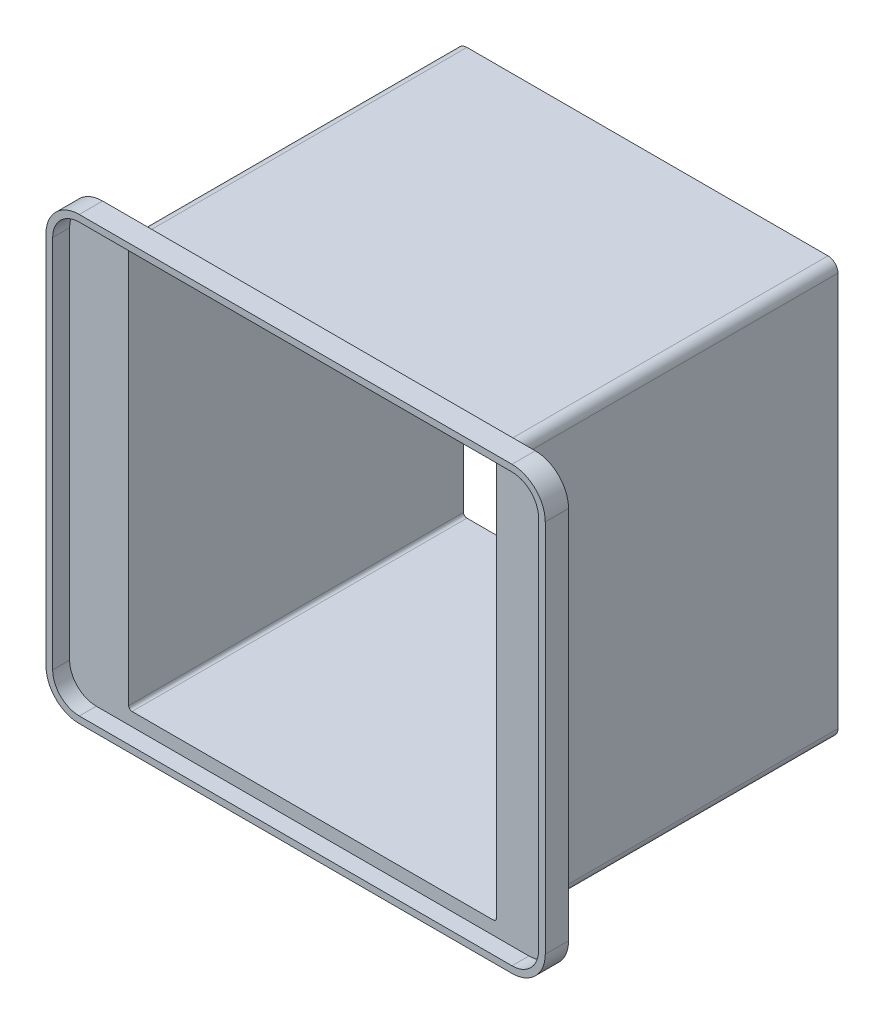
ISO-10303-21;
HEADER;
FILE_DESCRIPTION(('STEP AP214'),'2;1');
FILE_NAME('part.step','',(''),(''),'','','');
FILE_SCHEMA(('AUTOMOTIVE_DESIGN { 1 0 10303 214 1 1 1 1 }'));
ENDSEC;
DATA;
#1=APPLICATION_CONTEXT('core data for automotive mechanical design processes');
#2=APPLICATION_PROTOCOL_DEFINITION('international standard','automotive_design',2000,#1);
#3=PRODUCT_CONTEXT('',#1,'mechanical');
#4=PRODUCT('Part','Part','',(#3));
#5=PRODUCT_RELATED_PRODUCT_CATEGORY('part','',(#4));
#6=PRODUCT_DEFINITION_FORMATION('','',#4);
#7=PRODUCT_DEFINITION_CONTEXT('part definition',#1,'design');
#8=PRODUCT_DEFINITION('design','',#6,#7);
#9=PRODUCT_DEFINITION_SHAPE('','',#8);
#10=(LENGTH_UNIT() NAMED_UNIT(*) SI_UNIT(.MILLI.,.METRE.));
#11=(NAMED_UNIT(*) PLANE_ANGLE_UNIT() SI_UNIT($,.RADIAN.));
#12=(NAMED_UNIT(*) SI_UNIT($,.STERADIAN.) SOLID_ANGLE_UNIT());
#13=UNCERTAINTY_MEASURE_WITH_UNIT(LENGTH_MEASURE(1.E-05),#10,'distance_accuracy_value','');
#14=(GEOMETRIC_REPRESENTATION_CONTEXT(3) GLOBAL_UNCERTAINTY_ASSIGNED_CONTEXT((#13)) GLOBAL_UNIT_ASSIGNED_CONTEXT((#10,
#11,#12)) REPRESENTATION_CONTEXT('',''));
#15=CARTESIAN_POINT('',(0.,0.,0.));
#16=DIRECTION('',(0.,0.,1.));
#17=DIRECTION('',(1.,0.,0.));
#18=AXIS2_PLACEMENT_3D('',#15,#16,#17);
#19=CARTESIAN_POINT('',(-54.25,59.25,-98.705));
#20=DIRECTION('',(0.,0.,1.));
#21=DIRECTION('',(1.,0.,0.));
#22=AXIS2_PLACEMENT_3D('',#19,#20,#21);
#23=CYLINDRICAL_SURFACE('',#22,1.);
#24=CARTESIAN_POINT('',(-54.25,59.25,1.901));
#25=DIRECTION('',(0.,0.,1.));
#26=DIRECTION('',(1.,0.,0.));
#27=AXIS2_PLACEMENT_3D('',#24,#25,#26);
#28=CIRCLE('',#27,1.);
#29=CARTESIAN_POINT('',(-55.25,59.25,1.901));
#30=VERTEX_POINT('',#29);
#31=CARTESIAN_POINT('',(-54.25,60.25,1.901));
#32=VERTEX_POINT('',#31);
#33=EDGE_CURVE('E322',#30,#32,#28,.F.);
#34=ORIENTED_EDGE('',*,*,#33,.F.);
#35=DIRECTION('',(0.,0.,1.));
#36=VECTOR('',#35,1.);
#37=CARTESIAN_POINT('',(-55.25,59.25,-98.705));
#38=LINE('',#37,#36);
#39=CARTESIAN_POINT('',(-55.25,59.25,-98.705));
#40=VERTEX_POINT('',#39);
#41=EDGE_CURVE('E372',#40,#30,#38,.T.);
#42=ORIENTED_EDGE('',*,*,#41,.F.);
#43=CARTESIAN_POINT('',(-54.25,59.25,-98.705));
#44=DIRECTION('',(0.,0.,1.));
#45=DIRECTION('',(1.,0.,0.));
#46=AXIS2_PLACEMENT_3D('',#43,#44,#45);
#47=CIRCLE('',#46,1.);
#48=CARTESIAN_POINT('',(-54.25,60.25,-98.705));
#49=VERTEX_POINT('',#48);
#50=EDGE_CURVE('E338',#49,#40,#47,.T.);
#51=ORIENTED_EDGE('',*,*,#50,.F.);
#52=DIRECTION('',(0.,0.,1.));
#53=VECTOR('',#52,1.);
#54=CARTESIAN_POINT('',(-54.25,60.25,-98.705));
#55=LINE('',#54,#53);
#56=EDGE_CURVE('E373',#49,#32,#55,.T.);
#57=ORIENTED_EDGE('',*,*,#56,.T.);
#58=EDGE_LOOP('',(#34,#42,#51,#57));
#59=FACE_BOUND('',#58,.T.);
#60=ADVANCED_FACE('F33',(#59),#23,.F.);
#61=CARTESIAN_POINT('',(-54.25,60.25,-98.705));
#62=DIRECTION('',(0.,1.,0.));
#63=DIRECTION('',(-1.,0.,0.));
#64=AXIS2_PLACEMENT_3D('',#61,#62,#63);
#65=PLANE('',#64);
#66=DIRECTION('',(1.,0.,0.));
#67=VECTOR('',#66,1.);
#68=CARTESIAN_POINT('',(-54.25,60.25,1.901));
#69=LINE('',#68,#67);
#70=CARTESIAN_POINT('',(54.25,60.25,1.901));
#71=VERTEX_POINT('',#70);
#72=EDGE_CURVE('E320',#32,#71,#69,.T.);
#73=ORIENTED_EDGE('',*,*,#72,.F.);
#74=ORIENTED_EDGE('',*,*,#56,.F.);
#75=DIRECTION('',(-1.,0.,0.));
#76=VECTOR('',#75,1.);
#77=CARTESIAN_POINT('',(-54.25,60.25,-98.705));
#78=LINE('',#77,#76);
#79=CARTESIAN_POINT('',(54.25,60.25,-98.705));
#80=VERTEX_POINT('',#79);
#81=EDGE_CURVE('E369',#80,#49,#78,.T.);
#82=ORIENTED_EDGE('',*,*,#81,.F.);
#83=DIRECTION('',(0.,0.,1.));
#84=VECTOR('',#83,1.);
#85=CARTESIAN_POINT('',(54.25,60.25,-98.705));
#86=LINE('',#85,#84);
#87=EDGE_CURVE('E377',#80,#71,#86,.T.);
#88=ORIENTED_EDGE('',*,*,#87,.T.);
#89=EDGE_LOOP('',(#73,#74,#82,#88));
#90=FACE_BOUND('',#89,.T.);
#91=ADVANCED_FACE('F541',(#90),#65,.F.);
#92=CARTESIAN_POINT('',(54.25,59.25,-98.705));
#93=DIRECTION('',(0.,0.,1.));
#94=DIRECTION('',(1.,0.,0.));
#95=AXIS2_PLACEMENT_3D('',#92,#93,#94);
#96=CYLINDRICAL_SURFACE('',#95,1.);
#97=CARTESIAN_POINT('',(54.25,59.25,1.901));
#98=DIRECTION('',(0.,0.,1.));
#99=DIRECTION('',(1.,0.,0.));
#100=AXIS2_PLACEMENT_3D('',#97,#98,#99);
#101=CIRCLE('',#100,1.);
#102=CARTESIAN_POINT('',(55.25,59.25,1.901));
#103=VERTEX_POINT('',#102);
#104=EDGE_CURVE('E318',#71,#103,#101,.F.);
#105=ORIENTED_EDGE('',*,*,#104,.F.);
#106=ORIENTED_EDGE('',*,*,#87,.F.);
#107=CARTESIAN_POINT('',(54.25,59.25,-98.705));
#108=DIRECTION('',(0.,0.,1.));
#109=DIRECTION('',(-1.,0.,0.));
#110=AXIS2_PLACEMENT_3D('',#107,#108,#109);
#111=CIRCLE('',#110,1.);
#112=CARTESIAN_POINT('',(55.25,59.25,-98.705));
#113=VERTEX_POINT('',#112);
#114=EDGE_CURVE('E366',#113,#80,#111,.T.);
#115=ORIENTED_EDGE('',*,*,#114,.F.);
#116=DIRECTION('',(0.,0.,1.));
#117=VECTOR('',#116,1.);
#118=CARTESIAN_POINT('',(55.25,59.25,-98.705));
#119=LINE('',#118,#117);
#120=EDGE_CURVE('E380',#113,#103,#119,.T.);
#121=ORIENTED_EDGE('',*,*,#120,.T.);
#122=EDGE_LOOP('',(#105,#106,#115,#121));
#123=FACE_BOUND('',#122,.T.);
#124=ADVANCED_FACE('F547',(#123),#96,.F.);
#125=CARTESIAN_POINT('',(55.25,59.25,-98.705));
#126=DIRECTION('',(1.,0.,0.));
#127=DIRECTION('',(0.,0.,-1.));
#128=AXIS2_PLACEMENT_3D('',#125,#126,#127);
#129=PLANE('',#128);
#130=DIRECTION('',(0.,-1.,0.));
#131=VECTOR('',#130,1.);
#132=CARTESIAN_POINT('',(55.25,59.25,1.901));
#133=LINE('',#132,#131);
#134=CARTESIAN_POINT('',(55.25,-59.25,1.901));
#135=VERTEX_POINT('',#134);
#136=EDGE_CURVE('E316',#103,#135,#133,.T.);
#137=ORIENTED_EDGE('',*,*,#136,.F.);
#138=ORIENTED_EDGE('',*,*,#120,.F.);
#139=DIRECTION('',(0.,1.,0.));
#140=VECTOR('',#139,1.);
#141=CARTESIAN_POINT('',(55.25,59.25,-98.705));
#142=LINE('',#141,#140);
#143=CARTESIAN_POINT('',(55.25,-59.25,-98.705));
#144=VERTEX_POINT('',#143);
#145=EDGE_CURVE('E363',#144,#113,#142,.T.);
#146=ORIENTED_EDGE('',*,*,#145,.F.);
#147=DIRECTION('',(0.,0.,1.));
#148=VECTOR('',#147,1.);
#149=CARTESIAN_POINT('',(55.25,-59.25,-98.705));
#150=LINE('',#149,#148);
#151=EDGE_CURVE('E383',#144,#135,#150,.T.);
#152=ORIENTED_EDGE('',*,*,#151,.T.);
#153=EDGE_LOOP('',(#137,#138,#146,#152));
#154=FACE_BOUND('',#153,.T.);
#155=ADVANCED_FACE('F654',(#154),#129,.F.);
#156=CARTESIAN_POINT('',(54.25,-59.25,-98.705));
#157=DIRECTION('',(0.,0.,1.));
#158=DIRECTION('',(1.,0.,0.));
#159=AXIS2_PLACEMENT_3D('',#156,#157,#158);
#160=CYLINDRICAL_SURFACE('',#159,1.);
#161=CARTESIAN_POINT('',(54.25,-59.25,1.901));
#162=DIRECTION('',(0.,0.,1.));
#163=DIRECTION('',(1.,0.,0.));
#164=AXIS2_PLACEMENT_3D('',#161,#162,#163);
#165=CIRCLE('',#164,1.);
#166=CARTESIAN_POINT('',(54.25,-60.25,1.901));
#167=VERTEX_POINT('',#166);
#168=EDGE_CURVE('E314',#135,#167,#165,.F.);
#169=ORIENTED_EDGE('',*,*,#168,.F.);
#170=ORIENTED_EDGE('',*,*,#151,.F.);
#171=CARTESIAN_POINT('',(54.25,-59.25,-98.705));
#172=DIRECTION('',(0.,0.,1.));
#173=DIRECTION('',(1.,0.,0.));
#174=AXIS2_PLACEMENT_3D('',#171,#172,#173);
#175=CIRCLE('',#174,1.);
#176=CARTESIAN_POINT('',(54.25,-60.25,-98.705));
#177=VERTEX_POINT('',#176);
#178=EDGE_CURVE('E360',#177,#144,#175,.T.);
#179=ORIENTED_EDGE('',*,*,#178,.F.);
#180=DIRECTION('',(0.,0.,1.));
#181=VECTOR('',#180,1.);
#182=CARTESIAN_POINT('',(54.25,-60.25,-98.705));
#183=LINE('',#182,#181);
#184=EDGE_CURVE('E386',#177,#167,#183,.T.);
#185=ORIENTED_EDGE('',*,*,#184,.T.);
#186=EDGE_LOOP('',(#169,#170,#179,#185));
#187=FACE_BOUND('',#186,.T.);
#188=ADVANCED_FACE('F641',(#187),#160,.F.);
#189=CARTESIAN_POINT('',(-54.25,-60.25,-98.705));
#190=DIRECTION('',(0.,-1.,0.));
#191=DIRECTION('',(0.,0.,-1.));
#192=AXIS2_PLACEMENT_3D('',#189,#190,#191);
#193=PLANE('',#192);
#194=DIRECTION('',(-1.,0.,0.));
#195=VECTOR('',#194,1.);
#196=CARTESIAN_POINT('',(-54.25,-60.25,1.901));
#197=LINE('',#196,#195);
#198=CARTESIAN_POINT('',(-54.25,-60.25,1.901));
#199=VERTEX_POINT('',#198);
#200=EDGE_CURVE('E312',#167,#199,#197,.T.);
#201=ORIENTED_EDGE('',*,*,#200,.F.);
#202=ORIENTED_EDGE('',*,*,#184,.F.);
#203=DIRECTION('',(1.,0.,0.));
#204=VECTOR('',#203,1.);
#205=CARTESIAN_POINT('',(-54.25,-60.25,-98.705));
#206=LINE('',#205,#204);
#207=CARTESIAN_POINT('',(-54.25,-60.25,-98.705));
#208=VERTEX_POINT('',#207);
#209=EDGE_CURVE('E357',#208,#177,#206,.T.);
#210=ORIENTED_EDGE('',*,*,#209,.F.);
#211=DIRECTION('',(0.,0.,1.));
#212=VECTOR('',#211,1.);
#213=CARTESIAN_POINT('',(-54.25,-60.25,-98.705));
#214=LINE('',#213,#212);
#215=EDGE_CURVE('E389',#208,#199,#214,.T.);
#216=ORIENTED_EDGE('',*,*,#215,.T.);
#217=EDGE_LOOP('',(#201,#202,#210,#216));
#218=FACE_BOUND('',#217,.T.);
#219=ADVANCED_FACE('F629',(#218),#193,.F.);
#220=CARTESIAN_POINT('',(-54.25,-59.25,-98.705));
#221=DIRECTION('',(0.,0.,1.));
#222=DIRECTION('',(1.,0.,0.));
#223=AXIS2_PLACEMENT_3D('',#220,#221,#222);
#224=CYLINDRICAL_SURFACE('',#223,1.00000000000001);
#225=CARTESIAN_POINT('',(-54.25,-59.25,1.901));
#226=DIRECTION('',(0.,0.,1.));
#227=DIRECTION('',(1.,0.,0.));
#228=AXIS2_PLACEMENT_3D('',#225,#226,#227);
#229=CIRCLE('',#228,1.00000000000001);
#230=CARTESIAN_POINT('',(-55.25,-59.25,1.901));
#231=VERTEX_POINT('',#230);
#232=EDGE_CURVE('E47',#199,#231,#229,.F.);
#233=ORIENTED_EDGE('',*,*,#232,.F.);
#234=ORIENTED_EDGE('',*,*,#215,.F.);
#235=CARTESIAN_POINT('',(-54.25,-59.25,-98.705));
#236=DIRECTION('',(0.,0.,1.));
#237=DIRECTION('',(1.,0.,0.));
#238=AXIS2_PLACEMENT_3D('',#235,#236,#237);
#239=CIRCLE('',#238,1.00000000000001);
#240=CARTESIAN_POINT('',(-55.25,-59.25,-98.705));
#241=VERTEX_POINT('',#240);
#242=EDGE_CURVE('E354',#241,#208,#239,.T.);
#243=ORIENTED_EDGE('',*,*,#242,.F.);
#244=DIRECTION('',(0.,0.,1.));
#245=VECTOR('',#244,1.);
#246=CARTESIAN_POINT('',(-55.25,-59.25,-98.705));
#247=LINE('',#246,#245);
#248=EDGE_CURVE('E392',#241,#231,#247,.T.);
#249=ORIENTED_EDGE('',*,*,#248,.T.);
#250=EDGE_LOOP('',(#233,#234,#243,#249));
#251=FACE_BOUND('',#250,.T.);
#252=ADVANCED_FACE('F616',(#251),#224,.F.);
#253=CARTESIAN_POINT('',(-55.25,59.25,-98.705));
#254=DIRECTION('',(-1.,0.,0.));
#255=DIRECTION('',(0.,0.,1.));
#256=AXIS2_PLACEMENT_3D('',#253,#254,#255);
#257=PLANE('',#256);
#258=DIRECTION('',(0.,1.,0.));
#259=VECTOR('',#258,1.);
#260=CARTESIAN_POINT('',(-55.25,59.25,1.901));
#261=LINE('',#260,#259);
#262=EDGE_CURVE('E11',#231,#30,#261,.T.);
#263=ORIENTED_EDGE('',*,*,#262,.F.);
#264=ORIENTED_EDGE('',*,*,#248,.F.);
#265=DIRECTION('',(0.,-1.,0.));
#266=VECTOR('',#265,1.);
#267=CARTESIAN_POINT('',(-55.25,59.25,-98.705));
#268=LINE('',#267,#266);
#269=EDGE_CURVE('E351',#40,#241,#268,.T.);
#270=ORIENTED_EDGE('',*,*,#269,.F.);
#271=ORIENTED_EDGE('',*,*,#41,.T.);
#272=EDGE_LOOP('',(#263,#264,#270,#271));
#273=FACE_BOUND('',#272,.T.);
#274=ADVANCED_FACE('F553',(#273),#257,.F.);
#275=CARTESIAN_POINT('',(54.25,59.25,-98.705));
#276=DIRECTION('',(0.,0.,1.));
#277=DIRECTION('',(1.,0.,0.));
#278=AXIS2_PLACEMENT_3D('',#275,#276,#277);
#279=CYLINDRICAL_SURFACE('',#278,3.);
#280=CARTESIAN_POINT('',(54.25,59.25,0.));
#281=DIRECTION('',(0.,0.,1.));
#282=DIRECTION('',(-1.,0.,0.));
#283=AXIS2_PLACEMENT_3D('',#280,#281,#282);
#284=CIRCLE('',#283,3.);
#285=CARTESIAN_POINT('',(57.25,59.25,0.));
#286=VERTEX_POINT('',#285);
#287=CARTESIAN_POINT('',(54.25,62.25,0.));
#288=VERTEX_POINT('',#287);
#289=EDGE_CURVE('E376',#286,#288,#284,.T.);
#290=ORIENTED_EDGE('',*,*,#289,.F.);
#291=DIRECTION('',(0.,0.,1.));
#292=VECTOR('',#291,1.);
#293=CARTESIAN_POINT('',(57.25,59.25,-98.705));
#294=LINE('',#293,#292);
#295=CARTESIAN_POINT('',(57.25,59.25,-98.705));
#296=VERTEX_POINT('',#295);
#297=EDGE_CURVE('E445',#296,#286,#294,.T.);
#298=ORIENTED_EDGE('',*,*,#297,.F.);
#299=CARTESIAN_POINT('',(54.25,59.25,-98.705));
#300=DIRECTION('',(0.,0.,1.));
#301=DIRECTION('',(-1.,0.,0.));
#302=AXIS2_PLACEMENT_3D('',#299,#300,#301);
#303=CIRCLE('',#302,3.);
#304=CARTESIAN_POINT('',(54.25,62.25,-98.705));
#305=VERTEX_POINT('',#304);
#306=EDGE_CURVE('E397',#296,#305,#303,.T.);
#307=ORIENTED_EDGE('',*,*,#306,.T.);
#308=DIRECTION('',(0.,0.,1.));
#309=VECTOR('',#308,1.);
#310=CARTESIAN_POINT('',(54.25,62.25,-98.705));
#311=LINE('',#310,#309);
#312=EDGE_CURVE('E422',#305,#288,#311,.T.);
#313=ORIENTED_EDGE('',*,*,#312,.T.);
#314=EDGE_LOOP('',(#290,#298,#307,#313));
#315=FACE_BOUND('',#314,.T.);
#316=ADVANCED_FACE('F564',(#315),#279,.T.);
#317=CARTESIAN_POINT('',(57.25,59.25,-98.705));
#318=DIRECTION('',(1.,0.,0.));
#319=DIRECTION('',(0.,0.,-1.));
#320=AXIS2_PLACEMENT_3D('',#317,#318,#319);
#321=PLANE('',#320);
#322=DIRECTION('',(0.,1.,0.));
#323=VECTOR('',#322,1.);
#324=CARTESIAN_POINT('',(57.25,59.25,0.));
#325=LINE('',#324,#323);
#326=CARTESIAN_POINT('',(57.25,-59.25,0.));
#327=VERTEX_POINT('',#326);
#328=EDGE_CURVE('E401',#327,#286,#325,.T.);
#329=ORIENTED_EDGE('',*,*,#328,.F.);
#330=DIRECTION('',(0.,0.,1.));
#331=VECTOR('',#330,1.);
#332=CARTESIAN_POINT('',(57.25,-59.25,-98.705));
#333=LINE('',#332,#331);
#334=CARTESIAN_POINT('',(57.25,-59.25,-98.705));
#335=VERTEX_POINT('',#334);
#336=EDGE_CURVE('E449',#335,#327,#333,.T.);
#337=ORIENTED_EDGE('',*,*,#336,.F.);
#338=DIRECTION('',(0.,1.,0.));
#339=VECTOR('',#338,1.);
#340=CARTESIAN_POINT('',(57.25,59.25,-98.705));
#341=LINE('',#340,#339);
#342=EDGE_CURVE('E419',#335,#296,#341,.T.);
#343=ORIENTED_EDGE('',*,*,#342,.T.);
#344=ORIENTED_EDGE('',*,*,#297,.T.);
#345=EDGE_LOOP('',(#329,#337,#343,#344));
#346=FACE_BOUND('',#345,.T.);
#347=ADVANCED_FACE('F560',(#346),#321,.T.);
#348=CARTESIAN_POINT('',(54.25,-59.25,-98.705));
#349=DIRECTION('',(0.,0.,1.));
#350=DIRECTION('',(1.,0.,0.));
#351=AXIS2_PLACEMENT_3D('',#348,#349,#350);
#352=CYLINDRICAL_SURFACE('',#351,3.);
#353=CARTESIAN_POINT('',(54.25,-59.25,0.));
#354=DIRECTION('',(0.,0.,1.));
#355=DIRECTION('',(1.,0.,0.));
#356=AXIS2_PLACEMENT_3D('',#353,#354,#355);
#357=CIRCLE('',#356,3.);
#358=CARTESIAN_POINT('',(54.25,-62.25,0.));
#359=VERTEX_POINT('',#358);
#360=EDGE_CURVE('E440',#359,#327,#357,.T.);
#361=ORIENTED_EDGE('',*,*,#360,.F.);
#362=DIRECTION('',(0.,0.,1.));
#363=VECTOR('',#362,1.);
#364=CARTESIAN_POINT('',(54.25,-62.25,-98.705));
#365=LINE('',#364,#363);
#366=CARTESIAN_POINT('',(54.25,-62.25,-98.705));
#367=VERTEX_POINT('',#366);
#368=EDGE_CURVE('E451',#367,#359,#365,.T.);
#369=ORIENTED_EDGE('',*,*,#368,.F.);
#370=CARTESIAN_POINT('',(54.25,-59.25,-98.705));
#371=DIRECTION('',(0.,0.,1.));
#372=DIRECTION('',(1.,0.,0.));
#373=AXIS2_PLACEMENT_3D('',#370,#371,#372);
#374=CIRCLE('',#373,3.);
#375=EDGE_CURVE('E416',#367,#335,#374,.T.);
#376=ORIENTED_EDGE('',*,*,#375,.T.);
#377=ORIENTED_EDGE('',*,*,#336,.T.);
#378=EDGE_LOOP('',(#361,#369,#376,#377));
#379=FACE_BOUND('',#378,.T.);
#380=ADVANCED_FACE('F563',(#379),#352,.T.);
#381=CARTESIAN_POINT('',(-54.25,-62.25,-98.705));
#382=DIRECTION('',(0.,-1.,0.));
#383=DIRECTION('',(1.,0.,0.));
#384=AXIS2_PLACEMENT_3D('',#381,#382,#383);
#385=PLANE('',#384);
#386=DIRECTION('',(1.,0.,0.));
#387=VECTOR('',#386,1.);
#388=CARTESIAN_POINT('',(-54.25,-62.25,0.));
#389=LINE('',#388,#387);
#390=CARTESIAN_POINT('',(-54.25,-62.25,0.));
#391=VERTEX_POINT('',#390);
#392=EDGE_CURVE('E437',#391,#359,#389,.T.);
#393=ORIENTED_EDGE('',*,*,#392,.F.);
#394=DIRECTION('',(0.,0.,1.));
#395=VECTOR('',#394,1.);
#396=CARTESIAN_POINT('',(-54.25,-62.25,-98.705));
#397=LINE('',#396,#395);
#398=CARTESIAN_POINT('',(-54.25,-62.25,-98.705));
#399=VERTEX_POINT('',#398);
#400=EDGE_CURVE('E453',#399,#391,#397,.T.);
#401=ORIENTED_EDGE('',*,*,#400,.F.);
#402=DIRECTION('',(1.,0.,0.));
#403=VECTOR('',#402,1.);
#404=CARTESIAN_POINT('',(-54.25,-62.25,-98.705));
#405=LINE('',#404,#403);
#406=EDGE_CURVE('E413',#399,#367,#405,.T.);
#407=ORIENTED_EDGE('',*,*,#406,.T.);
#408=ORIENTED_EDGE('',*,*,#368,.T.);
#409=EDGE_LOOP('',(#393,#401,#407,#408));
#410=FACE_BOUND('',#409,.T.);
#411=ADVANCED_FACE('F568',(#410),#385,.T.);
#412=CARTESIAN_POINT('',(-54.25,-59.25,-98.705));
#413=DIRECTION('',(0.,0.,1.));
#414=DIRECTION('',(1.,0.,0.));
#415=AXIS2_PLACEMENT_3D('',#412,#413,#414);
#416=CYLINDRICAL_SURFACE('',#415,3.);
#417=CARTESIAN_POINT('',(-54.25,-59.25,0.));
#418=DIRECTION('',(0.,0.,1.));
#419=DIRECTION('',(1.,0.,0.));
#420=AXIS2_PLACEMENT_3D('',#417,#418,#419);
#421=CIRCLE('',#420,3.);
#422=CARTESIAN_POINT('',(-57.25,-59.25,0.));
#423=VERTEX_POINT('',#422);
#424=EDGE_CURVE('E434',#423,#391,#421,.T.);
#425=ORIENTED_EDGE('',*,*,#424,.F.);
#426=DIRECTION('',(0.,0.,1.));
#427=VECTOR('',#426,1.);
#428=CARTESIAN_POINT('',(-57.25,-59.25,-98.705));
#429=LINE('',#428,#427);
#430=CARTESIAN_POINT('',(-57.25,-59.25,-98.705));
#431=VERTEX_POINT('',#430);
#432=EDGE_CURVE('E455',#431,#423,#429,.T.);
#433=ORIENTED_EDGE('',*,*,#432,.F.);
#434=CARTESIAN_POINT('',(-54.25,-59.25,-98.705));
#435=DIRECTION('',(0.,0.,1.));
#436=DIRECTION('',(1.,0.,0.));
#437=AXIS2_PLACEMENT_3D('',#434,#435,#436);
#438=CIRCLE('',#437,3.);
#439=EDGE_CURVE('E410',#431,#399,#438,.T.);
#440=ORIENTED_EDGE('',*,*,#439,.T.);
#441=ORIENTED_EDGE('',*,*,#400,.T.);
#442=EDGE_LOOP('',(#425,#433,#440,#441));
#443=FACE_BOUND('',#442,.T.);
#444=ADVANCED_FACE('F572',(#443),#416,.T.);
#445=CARTESIAN_POINT('',(-57.25,59.25,-98.705));
#446=DIRECTION('',(-1.,0.,0.));
#447=DIRECTION('',(0.,-1.,0.));
#448=AXIS2_PLACEMENT_3D('',#445,#446,#447);
#449=PLANE('',#448);
#450=DIRECTION('',(0.,-1.,0.));
#451=VECTOR('',#450,1.);
#452=CARTESIAN_POINT('',(-57.25,59.25,0.));
#453=LINE('',#452,#451);
#454=CARTESIAN_POINT('',(-57.25,59.25,0.));
#455=VERTEX_POINT('',#454);
#456=EDGE_CURVE('E431',#455,#423,#453,.T.);
#457=ORIENTED_EDGE('',*,*,#456,.F.);
#458=DIRECTION('',(0.,0.,1.));
#459=VECTOR('',#458,1.);
#460=CARTESIAN_POINT('',(-57.25,59.25,-98.705));
#461=LINE('',#460,#459);
#462=CARTESIAN_POINT('',(-57.25,59.25,-98.705));
#463=VERTEX_POINT('',#462);
#464=EDGE_CURVE('E457',#463,#455,#461,.T.);
#465=ORIENTED_EDGE('',*,*,#464,.F.);
#466=DIRECTION('',(0.,-1.,0.));
#467=VECTOR('',#466,1.);
#468=CARTESIAN_POINT('',(-57.25,59.25,-98.705));
#469=LINE('',#468,#467);
#470=EDGE_CURVE('E407',#463,#431,#469,.T.);
#471=ORIENTED_EDGE('',*,*,#470,.T.);
#472=ORIENTED_EDGE('',*,*,#432,.T.);
#473=EDGE_LOOP('',(#457,#465,#471,#472));
#474=FACE_BOUND('',#473,.T.);
#475=ADVANCED_FACE('F576',(#474),#449,.T.);
#476=CARTESIAN_POINT('',(-54.25,59.25,-98.705));
#477=DIRECTION('',(0.,0.,1.));
#478=DIRECTION('',(1.,0.,0.));
#479=AXIS2_PLACEMENT_3D('',#476,#477,#478);
#480=CYLINDRICAL_SURFACE('',#479,3.);
#481=CARTESIAN_POINT('',(-54.25,59.25,0.));
#482=DIRECTION('',(0.,0.,1.));
#483=DIRECTION('',(1.,0.,0.));
#484=AXIS2_PLACEMENT_3D('',#481,#482,#483);
#485=CIRCLE('',#484,3.);
#486=CARTESIAN_POINT('',(-54.25,62.25,0.));
#487=VERTEX_POINT('',#486);
#488=EDGE_CURVE('E428',#487,#455,#485,.T.);
#489=ORIENTED_EDGE('',*,*,#488,.F.);
#490=DIRECTION('',(0.,0.,1.));
#491=VECTOR('',#490,1.);
#492=CARTESIAN_POINT('',(-54.25,62.25,-98.705));
#493=LINE('',#492,#491);
#494=CARTESIAN_POINT('',(-54.25,62.25,-98.705));
#495=VERTEX_POINT('',#494);
#496=EDGE_CURVE('E459',#495,#487,#493,.T.);
#497=ORIENTED_EDGE('',*,*,#496,.F.);
#498=CARTESIAN_POINT('',(-54.25,59.25,-98.705));
#499=DIRECTION('',(0.,0.,1.));
#500=DIRECTION('',(1.,0.,0.));
#501=AXIS2_PLACEMENT_3D('',#498,#499,#500);
#502=CIRCLE('',#501,3.);
#503=EDGE_CURVE('E404',#495,#463,#502,.T.);
#504=ORIENTED_EDGE('',*,*,#503,.T.);
#505=ORIENTED_EDGE('',*,*,#464,.T.);
#506=EDGE_LOOP('',(#489,#497,#504,#505));
#507=FACE_BOUND('',#506,.T.);
#508=ADVANCED_FACE('F580',(#507),#480,.T.);
#509=CARTESIAN_POINT('',(-54.25,62.25,-98.705));
#510=DIRECTION('',(0.,1.,0.));
#511=DIRECTION('',(-1.,0.,0.));
#512=AXIS2_PLACEMENT_3D('',#509,#510,#511);
#513=PLANE('',#512);
#514=DIRECTION('',(-1.,0.,0.));
#515=VECTOR('',#514,1.);
#516=CARTESIAN_POINT('',(-54.25,62.25,0.));
#517=LINE('',#516,#515);
#518=EDGE_CURVE('E425',#288,#487,#517,.T.);
#519=ORIENTED_EDGE('',*,*,#518,.F.);
#520=ORIENTED_EDGE('',*,*,#312,.F.);
#521=DIRECTION('',(-1.,0.,0.));
#522=VECTOR('',#521,1.);
#523=CARTESIAN_POINT('',(-54.25,62.25,-98.705));
#524=LINE('',#523,#522);
#525=EDGE_CURVE('E400',#305,#495,#524,.T.);
#526=ORIENTED_EDGE('',*,*,#525,.T.);
#527=ORIENTED_EDGE('',*,*,#496,.T.);
#528=EDGE_LOOP('',(#519,#520,#526,#527));
#529=FACE_BOUND('',#528,.T.);
#530=ADVANCED_FACE('F558',(#529),#513,.T.);
#531=CARTESIAN_POINT('',(54.25,59.25,-98.705));
#532=DIRECTION('',(0.,0.,-1.));
#533=DIRECTION('',(-1.,0.,0.));
#534=AXIS2_PLACEMENT_3D('',#531,#532,#533);
#535=PLANE('',#534);
#536=ORIENTED_EDGE('',*,*,#50,.T.);
#537=ORIENTED_EDGE('',*,*,#269,.T.);
#538=ORIENTED_EDGE('',*,*,#242,.T.);
#539=ORIENTED_EDGE('',*,*,#209,.T.);
#540=ORIENTED_EDGE('',*,*,#178,.T.);
#541=ORIENTED_EDGE('',*,*,#145,.T.);
#542=ORIENTED_EDGE('',*,*,#114,.T.);
#543=ORIENTED_EDGE('',*,*,#81,.T.);
#544=EDGE_LOOP('',(#536,#537,#538,#539,#540,#541,#542,#543));
#545=FACE_BOUND('',#544,.T.);
#546=ORIENTED_EDGE('',*,*,#306,.F.);
#547=ORIENTED_EDGE('',*,*,#342,.F.);
#548=ORIENTED_EDGE('',*,*,#375,.F.);
#549=ORIENTED_EDGE('',*,*,#406,.F.);
#550=ORIENTED_EDGE('',*,*,#439,.F.);
#551=ORIENTED_EDGE('',*,*,#470,.F.);
#552=ORIENTED_EDGE('',*,*,#503,.F.);
#553=ORIENTED_EDGE('',*,*,#525,.F.);
#554=EDGE_LOOP('',(#546,#547,#548,#549,#550,#551,#552,#553));
#555=FACE_BOUND('',#554,.T.);
#556=ADVANCED_FACE('F555',(#545,#555),#535,.T.);
#557=CARTESIAN_POINT('',(0.,0.,7.));
#558=DIRECTION('',(0.,0.,-1.));
#559=DIRECTION('',(-1.,0.,0.));
#560=AXIS2_PLACEMENT_3D('',#557,#558,#559);
#561=PLANE('',#560);
#562=DIRECTION('',(0.,1.,0.));
#563=VECTOR('',#562,1.);
#564=CARTESIAN_POINT('',(73.,-56.25,7.));
#565=LINE('',#564,#563);
#566=CARTESIAN_POINT('',(73.,-56.25,7.));
#567=VERTEX_POINT('',#566);
#568=CARTESIAN_POINT('',(73.,56.25,7.));
#569=VERTEX_POINT('',#568);
#570=EDGE_CURVE('E282',#567,#569,#565,.T.);
#571=ORIENTED_EDGE('',*,*,#570,.F.);
#572=CARTESIAN_POINT('',(65.,-56.25,7.));
#573=DIRECTION('',(0.,0.,1.));
#574=DIRECTION('',(1.,0.,0.));
#575=AXIS2_PLACEMENT_3D('',#572,#573,#574);
#576=CIRCLE('',#575,8.);
#577=CARTESIAN_POINT('',(65.,-64.25,7.));
#578=VERTEX_POINT('',#577);
#579=EDGE_CURVE('E55',#578,#567,#576,.T.);
#580=ORIENTED_EDGE('',*,*,#579,.F.);
#581=DIRECTION('',(1.,0.,0.));
#582=VECTOR('',#581,1.);
#583=CARTESIAN_POINT('',(-65.,-64.25,7.));
#584=LINE('',#583,#582);
#585=CARTESIAN_POINT('',(-65.,-64.25,7.));
#586=VERTEX_POINT('',#585);
#587=EDGE_CURVE('E262',#586,#578,#584,.T.);
#588=ORIENTED_EDGE('',*,*,#587,.F.);
#589=CARTESIAN_POINT('',(-65.,-56.25,7.));
#590=DIRECTION('',(0.,0.,1.));
#591=DIRECTION('',(1.,0.,0.));
#592=AXIS2_PLACEMENT_3D('',#589,#590,#591);
#593=CIRCLE('',#592,7.99999999999998);
#594=CARTESIAN_POINT('',(-73.,-56.25,7.));
#595=VERTEX_POINT('',#594);
#596=EDGE_CURVE('E265',#595,#586,#593,.T.);
#597=ORIENTED_EDGE('',*,*,#596,.F.);
#598=DIRECTION('',(0.,-1.,0.));
#599=VECTOR('',#598,1.);
#600=CARTESIAN_POINT('',(-73.,56.25,7.));
#601=LINE('',#600,#599);
#602=CARTESIAN_POINT('',(-73.,56.25,7.));
#603=VERTEX_POINT('',#602);
#604=EDGE_CURVE('E293',#603,#595,#601,.T.);
#605=ORIENTED_EDGE('',*,*,#604,.F.);
#606=CARTESIAN_POINT('',(-65.,56.25,7.));
#607=DIRECTION('',(0.,0.,1.));
#608=DIRECTION('',(1.,0.,0.));
#609=AXIS2_PLACEMENT_3D('',#606,#607,#608);
#610=CIRCLE('',#609,8.);
#611=CARTESIAN_POINT('',(-65.,64.25,7.));
#612=VERTEX_POINT('',#611);
#613=EDGE_CURVE('E290',#612,#603,#610,.T.);
#614=ORIENTED_EDGE('',*,*,#613,.F.);
#615=DIRECTION('',(-1.,0.,0.));
#616=VECTOR('',#615,1.);
#617=CARTESIAN_POINT('',(65.,64.25,7.));
#618=LINE('',#617,#616);
#619=CARTESIAN_POINT('',(65.,64.25,7.));
#620=VERTEX_POINT('',#619);
#621=EDGE_CURVE('E287',#620,#612,#618,.T.);
#622=ORIENTED_EDGE('',*,*,#621,.F.);
#623=CARTESIAN_POINT('',(65.,56.25,7.));
#624=DIRECTION('',(0.,0.,1.));
#625=DIRECTION('',(1.,0.,0.));
#626=AXIS2_PLACEMENT_3D('',#623,#624,#625);
#627=CIRCLE('',#626,8.);
#628=EDGE_CURVE('E284',#569,#620,#627,.T.);
#629=ORIENTED_EDGE('',*,*,#628,.F.);
#630=EDGE_LOOP('',(#571,#580,#588,#597,#605,#614,#622,#629));
#631=FACE_BOUND('',#630,.T.);
#632=DIRECTION('',(0.,1.,0.));
#633=VECTOR('',#632,1.);
#634=CARTESIAN_POINT('',(75.,66.25,7.));
#635=LINE('',#634,#633);
#636=CARTESIAN_POINT('',(75.,-56.25,7.));
#637=VERTEX_POINT('',#636);
#638=CARTESIAN_POINT('',(75.,56.25,7.));
#639=VERTEX_POINT('',#638);
#640=EDGE_CURVE('E332',#637,#639,#635,.T.);
#641=ORIENTED_EDGE('',*,*,#640,.T.);
#642=CARTESIAN_POINT('',(65.,56.25,7.));
#643=DIRECTION('',(0.,0.,-1.));
#644=DIRECTION('',(-1.,0.,0.));
#645=AXIS2_PLACEMENT_3D('',#642,#643,#644);
#646=CIRCLE('',#645,10.);
#647=CARTESIAN_POINT('',(65.,66.25,7.));
#648=VERTEX_POINT('',#647);
#649=EDGE_CURVE('E485',#639,#648,#646,.F.);
#650=ORIENTED_EDGE('',*,*,#649,.T.);
#651=DIRECTION('',(-1.,0.,0.));
#652=VECTOR('',#651,1.);
#653=CARTESIAN_POINT('',(75.,66.25,7.));
#654=LINE('',#653,#652);
#655=CARTESIAN_POINT('',(-65.,66.25,7.));
#656=VERTEX_POINT('',#655);
#657=EDGE_CURVE('E335',#648,#656,#654,.T.);
#658=ORIENTED_EDGE('',*,*,#657,.T.);
#659=CARTESIAN_POINT('',(-65.,56.25,7.));
#660=DIRECTION('',(0.,0.,-1.));
#661=DIRECTION('',(-1.,0.,0.));
#662=AXIS2_PLACEMENT_3D('',#659,#660,#661);
#663=CIRCLE('',#662,10.);
#664=CARTESIAN_POINT('',(-75.,56.25,7.));
#665=VERTEX_POINT('',#664);
#666=EDGE_CURVE('E479',#656,#665,#663,.F.);
#667=ORIENTED_EDGE('',*,*,#666,.T.);
#668=DIRECTION('',(0.,-1.,0.));
#669=VECTOR('',#668,1.);
#670=CARTESIAN_POINT('',(-75.,66.25,7.));
#671=LINE('',#670,#669);
#672=CARTESIAN_POINT('',(-75.,-56.25,7.));
#673=VERTEX_POINT('',#672);
#674=EDGE_CURVE('E325',#665,#673,#671,.T.);
#675=ORIENTED_EDGE('',*,*,#674,.T.);
#676=CARTESIAN_POINT('',(-65.,-56.25,7.));
#677=DIRECTION('',(0.,0.,-1.));
#678=DIRECTION('',(-1.,0.,0.));
#679=AXIS2_PLACEMENT_3D('',#676,#677,#678);
#680=CIRCLE('',#679,10.);
#681=CARTESIAN_POINT('',(-65.,-66.25,7.));
#682=VERTEX_POINT('',#681);
#683=EDGE_CURVE('E481',#673,#682,#680,.F.);
#684=ORIENTED_EDGE('',*,*,#683,.T.);
#685=DIRECTION('',(1.,0.,0.));
#686=VECTOR('',#685,1.);
#687=CARTESIAN_POINT('',(75.,-66.25,7.));
#688=LINE('',#687,#686);
#689=CARTESIAN_POINT('',(65.,-66.25,7.));
#690=VERTEX_POINT('',#689);
#691=EDGE_CURVE('E328',#682,#690,#688,.T.);
#692=ORIENTED_EDGE('',*,*,#691,.T.);
#693=CARTESIAN_POINT('',(65.,-56.25,7.));
#694=DIRECTION('',(0.,0.,-1.));
#695=DIRECTION('',(-1.,0.,0.));
#696=AXIS2_PLACEMENT_3D('',#693,#694,#695);
#697=CIRCLE('',#696,10.);
#698=EDGE_CURVE('E483',#690,#637,#697,.F.);
#699=ORIENTED_EDGE('',*,*,#698,.T.);
#700=EDGE_LOOP('',(#641,#650,#658,#667,#675,#684,#692,#699));
#701=FACE_BOUND('',#700,.T.);
#702=ADVANCED_FACE('F503',(#631,#701),#561,.F.);
#703=CARTESIAN_POINT('',(0.,0.,0.));
#704=DIRECTION('',(0.,0.,-1.));
#705=DIRECTION('',(-1.,0.,0.));
#706=AXIS2_PLACEMENT_3D('',#703,#704,#705);
#707=PLANE('',#706);
#708=ORIENTED_EDGE('',*,*,#328,.T.);
#709=ORIENTED_EDGE('',*,*,#289,.T.);
#710=ORIENTED_EDGE('',*,*,#518,.T.);
#711=ORIENTED_EDGE('',*,*,#488,.T.);
#712=ORIENTED_EDGE('',*,*,#456,.T.);
#713=ORIENTED_EDGE('',*,*,#424,.T.);
#714=ORIENTED_EDGE('',*,*,#392,.T.);
#715=ORIENTED_EDGE('',*,*,#360,.T.);
#716=EDGE_LOOP('',(#708,#709,#710,#711,#712,#713,#714,#715));
#717=FACE_BOUND('',#716,.T.);
#718=DIRECTION('',(-1.,0.,0.));
#719=VECTOR('',#718,1.);
#720=CARTESIAN_POINT('',(75.,66.25,0.));
#721=LINE('',#720,#719);
#722=CARTESIAN_POINT('',(65.,66.25,0.));
#723=VERTEX_POINT('',#722);
#724=CARTESIAN_POINT('',(-65.,66.25,0.));
#725=VERTEX_POINT('',#724);
#726=EDGE_CURVE('E329',#723,#725,#721,.T.);
#727=ORIENTED_EDGE('',*,*,#726,.F.);
#728=CARTESIAN_POINT('',(65.,56.25,0.));
#729=DIRECTION('',(0.,0.,-1.));
#730=DIRECTION('',(-1.,0.,0.));
#731=AXIS2_PLACEMENT_3D('',#728,#729,#730);
#732=CIRCLE('',#731,10.);
#733=CARTESIAN_POINT('',(75.,56.25,0.));
#734=VERTEX_POINT('',#733);
#735=EDGE_CURVE('E472',#723,#734,#732,.T.);
#736=ORIENTED_EDGE('',*,*,#735,.T.);
#737=DIRECTION('',(0.,1.,0.));
#738=VECTOR('',#737,1.);
#739=CARTESIAN_POINT('',(75.,66.25,0.));
#740=LINE('',#739,#738);
#741=CARTESIAN_POINT('',(75.,-56.25,0.));
#742=VERTEX_POINT('',#741);
#743=EDGE_CURVE('E344',#742,#734,#740,.T.);
#744=ORIENTED_EDGE('',*,*,#743,.F.);
#745=CARTESIAN_POINT('',(65.,-56.25,0.));
#746=DIRECTION('',(0.,0.,-1.));
#747=DIRECTION('',(-1.,0.,0.));
#748=AXIS2_PLACEMENT_3D('',#745,#746,#747);
#749=CIRCLE('',#748,10.);
#750=CARTESIAN_POINT('',(65.,-66.25,0.));
#751=VERTEX_POINT('',#750);
#752=EDGE_CURVE('E470',#742,#751,#749,.T.);
#753=ORIENTED_EDGE('',*,*,#752,.T.);
#754=DIRECTION('',(1.,0.,0.));
#755=VECTOR('',#754,1.);
#756=CARTESIAN_POINT('',(75.,-66.25,0.));
#757=LINE('',#756,#755);
#758=CARTESIAN_POINT('',(-65.,-66.25,0.));
#759=VERTEX_POINT('',#758);
#760=EDGE_CURVE('E341',#759,#751,#757,.T.);
#761=ORIENTED_EDGE('',*,*,#760,.F.);
#762=CARTESIAN_POINT('',(-65.,-56.25,0.));
#763=DIRECTION('',(0.,0.,-1.));
#764=DIRECTION('',(-1.,0.,0.));
#765=AXIS2_PLACEMENT_3D('',#762,#763,#764);
#766=CIRCLE('',#765,10.);
#767=CARTESIAN_POINT('',(-75.,-56.25,0.));
#768=VERTEX_POINT('',#767);
#769=EDGE_CURVE('E468',#759,#768,#766,.T.);
#770=ORIENTED_EDGE('',*,*,#769,.T.);
#771=DIRECTION('',(0.,-1.,0.));
#772=VECTOR('',#771,1.);
#773=CARTESIAN_POINT('',(-75.,66.25,0.));
#774=LINE('',#773,#772);
#775=CARTESIAN_POINT('',(-75.,56.25,0.));
#776=VERTEX_POINT('',#775);
#777=EDGE_CURVE('E324',#776,#768,#774,.T.);
#778=ORIENTED_EDGE('',*,*,#777,.F.);
#779=CARTESIAN_POINT('',(-65.,56.25,0.));
#780=DIRECTION('',(0.,0.,-1.));
#781=DIRECTION('',(-1.,0.,0.));
#782=AXIS2_PLACEMENT_3D('',#779,#780,#781);
#783=CIRCLE('',#782,10.);
#784=EDGE_CURVE('E466',#776,#725,#783,.T.);
#785=ORIENTED_EDGE('',*,*,#784,.T.);
#786=EDGE_LOOP('',(#727,#736,#744,#753,#761,#770,#778,#785));
#787=FACE_BOUND('',#786,.T.);
#788=ADVANCED_FACE('F514',(#717,#787),#707,.T.);
#789=CARTESIAN_POINT('',(-75.,66.25,7.));
#790=DIRECTION('',(1.,0.,0.));
#791=DIRECTION('',(0.,1.,0.));
#792=AXIS2_PLACEMENT_3D('',#789,#790,#791);
#793=PLANE('',#792);
#794=ORIENTED_EDGE('',*,*,#777,.T.);
#795=DIRECTION('',(0.,0.,-1.));
#796=VECTOR('',#795,1.);
#797=CARTESIAN_POINT('',(-75.,-56.25,7.));
#798=LINE('',#797,#796);
#799=EDGE_CURVE('E41',#768,#673,#798,.F.);
#800=ORIENTED_EDGE('',*,*,#799,.T.);
#801=ORIENTED_EDGE('',*,*,#674,.F.);
#802=DIRECTION('',(0.,0.,-1.));
#803=VECTOR('',#802,1.);
#804=CARTESIAN_POINT('',(-75.,56.25,7.));
#805=LINE('',#804,#803);
#806=EDGE_CURVE('E492',#665,#776,#805,.T.);
#807=ORIENTED_EDGE('',*,*,#806,.T.);
#808=EDGE_LOOP('',(#794,#800,#801,#807));
#809=FACE_BOUND('',#808,.T.);
#810=ADVANCED_FACE('F497',(#809),#793,.F.);
#811=CARTESIAN_POINT('',(75.,-66.25,7.));
#812=DIRECTION('',(0.,1.,0.));
#813=DIRECTION('',(-1.,0.,0.));
#814=AXIS2_PLACEMENT_3D('',#811,#812,#813);
#815=PLANE('',#814);
#816=ORIENTED_EDGE('',*,*,#760,.T.);
#817=DIRECTION('',(0.,0.,-1.));
#818=VECTOR('',#817,1.);
#819=CARTESIAN_POINT('',(65.,-66.25,7.));
#820=LINE('',#819,#818);
#821=EDGE_CURVE('E490',#751,#690,#820,.F.);
#822=ORIENTED_EDGE('',*,*,#821,.T.);
#823=ORIENTED_EDGE('',*,*,#691,.F.);
#824=DIRECTION('',(0.,0.,-1.));
#825=VECTOR('',#824,1.);
#826=CARTESIAN_POINT('',(-65.,-66.25,7.));
#827=LINE('',#826,#825);
#828=EDGE_CURVE('E487',#682,#759,#827,.T.);
#829=ORIENTED_EDGE('',*,*,#828,.T.);
#830=EDGE_LOOP('',(#816,#822,#823,#829));
#831=FACE_BOUND('',#830,.T.);
#832=ADVANCED_FACE('F510',(#831),#815,.F.);
#833=CARTESIAN_POINT('',(75.,66.25,7.));
#834=DIRECTION('',(-1.,0.,0.));
#835=DIRECTION('',(0.,-1.,0.));
#836=AXIS2_PLACEMENT_3D('',#833,#834,#835);
#837=PLANE('',#836);
#838=ORIENTED_EDGE('',*,*,#743,.T.);
#839=DIRECTION('',(0.,0.,-1.));
#840=VECTOR('',#839,1.);
#841=CARTESIAN_POINT('',(75.,56.25,7.));
#842=LINE('',#841,#840);
#843=EDGE_CURVE('E477',#734,#639,#842,.F.);
#844=ORIENTED_EDGE('',*,*,#843,.T.);
#845=ORIENTED_EDGE('',*,*,#640,.F.);
#846=DIRECTION('',(0.,0.,-1.));
#847=VECTOR('',#846,1.);
#848=CARTESIAN_POINT('',(75.,-56.25,7.));
#849=LINE('',#848,#847);
#850=EDGE_CURVE('E474',#637,#742,#849,.T.);
#851=ORIENTED_EDGE('',*,*,#850,.T.);
#852=EDGE_LOOP('',(#838,#844,#845,#851));
#853=FACE_BOUND('',#852,.T.);
#854=ADVANCED_FACE('F522',(#853),#837,.F.);
#855=CARTESIAN_POINT('',(75.,66.25,7.));
#856=DIRECTION('',(0.,-1.,0.));
#857=DIRECTION('',(1.,0.,0.));
#858=AXIS2_PLACEMENT_3D('',#855,#856,#857);
#859=PLANE('',#858);
#860=ORIENTED_EDGE('',*,*,#657,.F.);
#861=DIRECTION('',(0.,0.,-1.));
#862=VECTOR('',#861,1.);
#863=CARTESIAN_POINT('',(65.,66.25,7.));
#864=LINE('',#863,#862);
#865=EDGE_CURVE('E463',#648,#723,#864,.T.);
#866=ORIENTED_EDGE('',*,*,#865,.T.);
#867=ORIENTED_EDGE('',*,*,#726,.T.);
#868=DIRECTION('',(0.,0.,-1.));
#869=VECTOR('',#868,1.);
#870=CARTESIAN_POINT('',(-65.,66.25,7.));
#871=LINE('',#870,#869);
#872=EDGE_CURVE('E448',#725,#656,#871,.F.);
#873=ORIENTED_EDGE('',*,*,#872,.T.);
#874=EDGE_LOOP('',(#860,#866,#867,#873));
#875=FACE_BOUND('',#874,.T.);
#876=ADVANCED_FACE('F530',(#875),#859,.F.);
#877=CARTESIAN_POINT('',(65.,56.25,7.));
#878=DIRECTION('',(0.,0.,-1.));
#879=DIRECTION('',(-1.,0.,0.));
#880=AXIS2_PLACEMENT_3D('',#877,#878,#879);
#881=CYLINDRICAL_SURFACE('',#880,10.);
#882=ORIENTED_EDGE('',*,*,#649,.F.);
#883=ORIENTED_EDGE('',*,*,#843,.F.);
#884=ORIENTED_EDGE('',*,*,#735,.F.);
#885=ORIENTED_EDGE('',*,*,#865,.F.);
#886=EDGE_LOOP('',(#882,#883,#884,#885));
#887=FACE_BOUND('',#886,.T.);
#888=ADVANCED_FACE('F528',(#887),#881,.T.);
#889=CARTESIAN_POINT('',(65.,-56.25,7.));
#890=DIRECTION('',(0.,0.,-1.));
#891=DIRECTION('',(-1.,0.,0.));
#892=AXIS2_PLACEMENT_3D('',#889,#890,#891);
#893=CYLINDRICAL_SURFACE('',#892,10.);
#894=ORIENTED_EDGE('',*,*,#698,.F.);
#895=ORIENTED_EDGE('',*,*,#821,.F.);
#896=ORIENTED_EDGE('',*,*,#752,.F.);
#897=ORIENTED_EDGE('',*,*,#850,.F.);
#898=EDGE_LOOP('',(#894,#895,#896,#897));
#899=FACE_BOUND('',#898,.T.);
#900=ADVANCED_FACE('F519',(#899),#893,.T.);
#901=CARTESIAN_POINT('',(-65.,-56.25,7.));
#902=DIRECTION('',(0.,0.,-1.));
#903=DIRECTION('',(-1.,0.,0.));
#904=AXIS2_PLACEMENT_3D('',#901,#902,#903);
#905=CYLINDRICAL_SURFACE('',#904,10.);
#906=ORIENTED_EDGE('',*,*,#683,.F.);
#907=ORIENTED_EDGE('',*,*,#799,.F.);
#908=ORIENTED_EDGE('',*,*,#769,.F.);
#909=ORIENTED_EDGE('',*,*,#828,.F.);
#910=EDGE_LOOP('',(#906,#907,#908,#909));
#911=FACE_BOUND('',#910,.T.);
#912=ADVANCED_FACE('F507',(#911),#905,.T.);
#913=CARTESIAN_POINT('',(-65.,56.25,7.));
#914=DIRECTION('',(0.,0.,-1.));
#915=DIRECTION('',(-1.,0.,0.));
#916=AXIS2_PLACEMENT_3D('',#913,#914,#915);
#917=CYLINDRICAL_SURFACE('',#916,10.);
#918=ORIENTED_EDGE('',*,*,#666,.F.);
#919=ORIENTED_EDGE('',*,*,#872,.F.);
#920=ORIENTED_EDGE('',*,*,#784,.F.);
#921=ORIENTED_EDGE('',*,*,#806,.F.);
#922=EDGE_LOOP('',(#918,#919,#920,#921));
#923=FACE_BOUND('',#922,.T.);
#924=ADVANCED_FACE('F35',(#923),#917,.T.);
#925=CARTESIAN_POINT('',(65.,-56.25,1.901));
#926=DIRECTION('',(0.,0.,1.));
#927=DIRECTION('',(1.,0.,0.));
#928=AXIS2_PLACEMENT_3D('',#925,#926,#927);
#929=PLANE('',#928);
#930=CARTESIAN_POINT('',(65.,-56.25,1.901));
#931=DIRECTION('',(0.,0.,1.));
#932=DIRECTION('',(1.,0.,0.));
#933=AXIS2_PLACEMENT_3D('',#930,#931,#932);
#934=CIRCLE('',#933,8.);
#935=CARTESIAN_POINT('',(65.,-64.25,1.901));
#936=VERTEX_POINT('',#935);
#937=CARTESIAN_POINT('',(73.,-56.25,1.901));
#938=VERTEX_POINT('',#937);
#939=EDGE_CURVE('E243',#936,#938,#934,.T.);
#940=ORIENTED_EDGE('',*,*,#939,.T.);
#941=DIRECTION('',(0.,1.,0.));
#942=VECTOR('',#941,1.);
#943=CARTESIAN_POINT('',(73.,-56.25,1.901));
#944=LINE('',#943,#942);
#945=CARTESIAN_POINT('',(73.,56.25,1.901));
#946=VERTEX_POINT('',#945);
#947=EDGE_CURVE('E252',#938,#946,#944,.T.);
#948=ORIENTED_EDGE('',*,*,#947,.T.);
#949=CARTESIAN_POINT('',(65.,56.25,1.901));
#950=DIRECTION('',(0.,0.,1.));
#951=DIRECTION('',(1.,0.,0.));
#952=AXIS2_PLACEMENT_3D('',#949,#950,#951);
#953=CIRCLE('',#952,8.);
#954=CARTESIAN_POINT('',(65.,64.25,1.901));
#955=VERTEX_POINT('',#954);
#956=EDGE_CURVE('E257',#946,#955,#953,.T.);
#957=ORIENTED_EDGE('',*,*,#956,.T.);
#958=DIRECTION('',(-1.,0.,0.));
#959=VECTOR('',#958,1.);
#960=CARTESIAN_POINT('',(65.,64.25,1.901));
#961=LINE('',#960,#959);
#962=CARTESIAN_POINT('',(-65.,64.25,1.901));
#963=VERTEX_POINT('',#962);
#964=EDGE_CURVE('E269',#955,#963,#961,.T.);
#965=ORIENTED_EDGE('',*,*,#964,.T.);
#966=CARTESIAN_POINT('',(-65.,56.25,1.901));
#967=DIRECTION('',(0.,0.,1.));
#968=DIRECTION('',(1.,0.,0.));
#969=AXIS2_PLACEMENT_3D('',#966,#967,#968);
#970=CIRCLE('',#969,8.);
#971=CARTESIAN_POINT('',(-73.,56.25,1.901));
#972=VERTEX_POINT('',#971);
#973=EDGE_CURVE('E272',#963,#972,#970,.T.);
#974=ORIENTED_EDGE('',*,*,#973,.T.);
#975=DIRECTION('',(0.,-1.,0.));
#976=VECTOR('',#975,1.);
#977=CARTESIAN_POINT('',(-73.,56.25,1.901));
#978=LINE('',#977,#976);
#979=CARTESIAN_POINT('',(-73.,-56.25,1.901));
#980=VERTEX_POINT('',#979);
#981=EDGE_CURVE('E275',#972,#980,#978,.T.);
#982=ORIENTED_EDGE('',*,*,#981,.T.);
#983=CARTESIAN_POINT('',(-65.,-56.25,1.901));
#984=DIRECTION('',(0.,0.,1.));
#985=DIRECTION('',(1.,0.,0.));
#986=AXIS2_PLACEMENT_3D('',#983,#984,#985);
#987=CIRCLE('',#986,7.99999999999998);
#988=CARTESIAN_POINT('',(-65.,-64.25,1.901));
#989=VERTEX_POINT('',#988);
#990=EDGE_CURVE('E278',#980,#989,#987,.T.);
#991=ORIENTED_EDGE('',*,*,#990,.T.);
#992=DIRECTION('',(1.,0.,0.));
#993=VECTOR('',#992,1.);
#994=CARTESIAN_POINT('',(-65.,-64.25,1.901));
#995=LINE('',#994,#993);
#996=EDGE_CURVE('E249',#989,#936,#995,.T.);
#997=ORIENTED_EDGE('',*,*,#996,.T.);
#998=EDGE_LOOP('',(#940,#948,#957,#965,#974,#982,#991,#997));
#999=FACE_BOUND('',#998,.T.);
#1000=ORIENTED_EDGE('',*,*,#33,.T.);
#1001=ORIENTED_EDGE('',*,*,#72,.T.);
#1002=ORIENTED_EDGE('',*,*,#104,.T.);
#1003=ORIENTED_EDGE('',*,*,#136,.T.);
#1004=ORIENTED_EDGE('',*,*,#168,.T.);
#1005=ORIENTED_EDGE('',*,*,#200,.T.);
#1006=ORIENTED_EDGE('',*,*,#232,.T.);
#1007=ORIENTED_EDGE('',*,*,#262,.T.);
#1008=EDGE_LOOP('',(#1000,#1001,#1002,#1003,#1004,#1005,#1006,#1007));
#1009=FACE_BOUND('',#1008,.T.);
#1010=ADVANCED_FACE('F259',(#999,#1009),#929,.T.);
#1011=CARTESIAN_POINT('',(65.,-56.25,1.901));
#1012=DIRECTION('',(0.,0.,1.));
#1013=DIRECTION('',(1.,0.,0.));
#1014=AXIS2_PLACEMENT_3D('',#1011,#1012,#1013);
#1015=CYLINDRICAL_SURFACE('',#1014,8.);
#1016=ORIENTED_EDGE('',*,*,#579,.T.);
#1017=DIRECTION('',(0.,0.,1.));
#1018=VECTOR('',#1017,1.);
#1019=CARTESIAN_POINT('',(73.,-56.25,1.901));
#1020=LINE('',#1019,#1018);
#1021=EDGE_CURVE('E239',#938,#567,#1020,.T.);
#1022=ORIENTED_EDGE('',*,*,#1021,.F.);
#1023=ORIENTED_EDGE('',*,*,#939,.F.);
#1024=DIRECTION('',(0.,0.,1.));
#1025=VECTOR('',#1024,1.);
#1026=CARTESIAN_POINT('',(65.,-64.25,1.901));
#1027=LINE('',#1026,#1025);
#1028=EDGE_CURVE('E298',#936,#578,#1027,.T.);
#1029=ORIENTED_EDGE('',*,*,#1028,.T.);
#1030=EDGE_LOOP('',(#1016,#1022,#1023,#1029));
#1031=FACE_BOUND('',#1030,.T.);
#1032=ADVANCED_FACE('F241',(#1031),#1015,.F.);
#1033=CARTESIAN_POINT('',(-65.,-64.25,1.901));
#1034=DIRECTION('',(0.,-1.,0.));
#1035=DIRECTION('',(1.,0.,0.));
#1036=AXIS2_PLACEMENT_3D('',#1033,#1034,#1035);
#1037=PLANE('',#1036);
#1038=ORIENTED_EDGE('',*,*,#587,.T.);
#1039=ORIENTED_EDGE('',*,*,#1028,.F.);
#1040=ORIENTED_EDGE('',*,*,#996,.F.);
#1041=DIRECTION('',(0.,0.,1.));
#1042=VECTOR('',#1041,1.);
#1043=CARTESIAN_POINT('',(-65.,-64.25,1.901));
#1044=LINE('',#1043,#1042);
#1045=EDGE_CURVE('E300',#989,#586,#1044,.T.);
#1046=ORIENTED_EDGE('',*,*,#1045,.T.);
#1047=EDGE_LOOP('',(#1038,#1039,#1040,#1046));
#1048=FACE_BOUND('',#1047,.T.);
#1049=ADVANCED_FACE('F712',(#1048),#1037,.F.);
#1050=CARTESIAN_POINT('',(-65.,-56.25,1.901));
#1051=DIRECTION('',(0.,0.,1.));
#1052=DIRECTION('',(1.,0.,0.));
#1053=AXIS2_PLACEMENT_3D('',#1050,#1051,#1052);
#1054=CYLINDRICAL_SURFACE('',#1053,7.99999999999998);
#1055=ORIENTED_EDGE('',*,*,#596,.T.);
#1056=ORIENTED_EDGE('',*,*,#1045,.F.);
#1057=ORIENTED_EDGE('',*,*,#990,.F.);
#1058=DIRECTION('',(0.,0.,1.));
#1059=VECTOR('',#1058,1.);
#1060=CARTESIAN_POINT('',(-73.,-56.25,1.901));
#1061=LINE('',#1060,#1059);
#1062=EDGE_CURVE('E302',#980,#595,#1061,.T.);
#1063=ORIENTED_EDGE('',*,*,#1062,.T.);
#1064=EDGE_LOOP('',(#1055,#1056,#1057,#1063));
#1065=FACE_BOUND('',#1064,.T.);
#1066=ADVANCED_FACE('F720',(#1065),#1054,.F.);
#1067=CARTESIAN_POINT('',(-73.,56.25,1.901));
#1068=DIRECTION('',(-1.,0.,0.));
#1069=DIRECTION('',(0.,-1.,0.));
#1070=AXIS2_PLACEMENT_3D('',#1067,#1068,#1069);
#1071=PLANE('',#1070);
#1072=ORIENTED_EDGE('',*,*,#604,.T.);
#1073=ORIENTED_EDGE('',*,*,#1062,.F.);
#1074=ORIENTED_EDGE('',*,*,#981,.F.);
#1075=DIRECTION('',(0.,0.,1.));
#1076=VECTOR('',#1075,1.);
#1077=CARTESIAN_POINT('',(-73.,56.25,1.901));
#1078=LINE('',#1077,#1076);
#1079=EDGE_CURVE('E304',#972,#603,#1078,.T.);
#1080=ORIENTED_EDGE('',*,*,#1079,.T.);
#1081=EDGE_LOOP('',(#1072,#1073,#1074,#1080));
#1082=FACE_BOUND('',#1081,.T.);
#1083=ADVANCED_FACE('F729',(#1082),#1071,.F.);
#1084=CARTESIAN_POINT('',(-65.,56.25,1.901));
#1085=DIRECTION('',(0.,0.,1.));
#1086=DIRECTION('',(1.,0.,0.));
#1087=AXIS2_PLACEMENT_3D('',#1084,#1085,#1086);
#1088=CYLINDRICAL_SURFACE('',#1087,8.);
#1089=ORIENTED_EDGE('',*,*,#613,.T.);
#1090=ORIENTED_EDGE('',*,*,#1079,.F.);
#1091=ORIENTED_EDGE('',*,*,#973,.F.);
#1092=DIRECTION('',(0.,0.,1.));
#1093=VECTOR('',#1092,1.);
#1094=CARTESIAN_POINT('',(-65.,64.25,1.901));
#1095=LINE('',#1094,#1093);
#1096=EDGE_CURVE('E306',#963,#612,#1095,.T.);
#1097=ORIENTED_EDGE('',*,*,#1096,.T.);
#1098=EDGE_LOOP('',(#1089,#1090,#1091,#1097));
#1099=FACE_BOUND('',#1098,.T.);
#1100=ADVANCED_FACE('F738',(#1099),#1088,.F.);
#1101=CARTESIAN_POINT('',(65.,64.25,1.901));
#1102=DIRECTION('',(0.,1.,0.));
#1103=DIRECTION('',(-1.,0.,0.));
#1104=AXIS2_PLACEMENT_3D('',#1101,#1102,#1103);
#1105=PLANE('',#1104);
#1106=ORIENTED_EDGE('',*,*,#621,.T.);
#1107=ORIENTED_EDGE('',*,*,#1096,.F.);
#1108=ORIENTED_EDGE('',*,*,#964,.F.);
#1109=DIRECTION('',(0.,0.,1.));
#1110=VECTOR('',#1109,1.);
#1111=CARTESIAN_POINT('',(65.,64.25,1.901));
#1112=LINE('',#1111,#1110);
#1113=EDGE_CURVE('E308',#955,#620,#1112,.T.);
#1114=ORIENTED_EDGE('',*,*,#1113,.T.);
#1115=EDGE_LOOP('',(#1106,#1107,#1108,#1114));
#1116=FACE_BOUND('',#1115,.T.);
#1117=ADVANCED_FACE('F747',(#1116),#1105,.F.);
#1118=CARTESIAN_POINT('',(65.,56.25,1.901));
#1119=DIRECTION('',(0.,0.,1.));
#1120=DIRECTION('',(1.,0.,0.));
#1121=AXIS2_PLACEMENT_3D('',#1118,#1119,#1120);
#1122=CYLINDRICAL_SURFACE('',#1121,8.);
#1123=ORIENTED_EDGE('',*,*,#628,.T.);
#1124=ORIENTED_EDGE('',*,*,#1113,.F.);
#1125=ORIENTED_EDGE('',*,*,#956,.F.);
#1126=DIRECTION('',(0.,0.,1.));
#1127=VECTOR('',#1126,1.);
#1128=CARTESIAN_POINT('',(73.,56.25,1.901));
#1129=LINE('',#1128,#1127);
#1130=EDGE_CURVE('E248',#946,#569,#1129,.T.);
#1131=ORIENTED_EDGE('',*,*,#1130,.T.);
#1132=EDGE_LOOP('',(#1123,#1124,#1125,#1131));
#1133=FACE_BOUND('',#1132,.T.);
#1134=ADVANCED_FACE('F756',(#1133),#1122,.F.);
#1135=CARTESIAN_POINT('',(73.,-56.25,1.901));
#1136=DIRECTION('',(1.,0.,0.));
#1137=DIRECTION('',(0.,1.,0.));
#1138=AXIS2_PLACEMENT_3D('',#1135,#1136,#1137);
#1139=PLANE('',#1138);
#1140=ORIENTED_EDGE('',*,*,#570,.T.);
#1141=ORIENTED_EDGE('',*,*,#1130,.F.);
#1142=ORIENTED_EDGE('',*,*,#947,.F.);
#1143=ORIENTED_EDGE('',*,*,#1021,.T.);
#1144=EDGE_LOOP('',(#1140,#1141,#1142,#1143));
#1145=FACE_BOUND('',#1144,.T.);
#1146=ADVANCED_FACE('F253',(#1145),#1139,.F.);
#1147=CLOSED_SHELL('',(#60,#91,#124,#155,#188,#219,#252,#274,#316,#347,#380,#411,#444,#475,#508,
#530,#556,#702,#788,#810,#832,#854,#876,#888,#900,#912,#924,#1010,#1032,#1049,#1066,#1083,#1100,
#1117,#1134,#1146));
#1148=MANIFOLD_SOLID_BREP('B2',#1147);
#1149=ADVANCED_BREP_SHAPE_REPRESENTATION('',(#18,#1148),#14);
#1150=SHAPE_DEFINITION_REPRESENTATION(#9,#1149);
ENDSEC;
END-ISO-10303-21;
